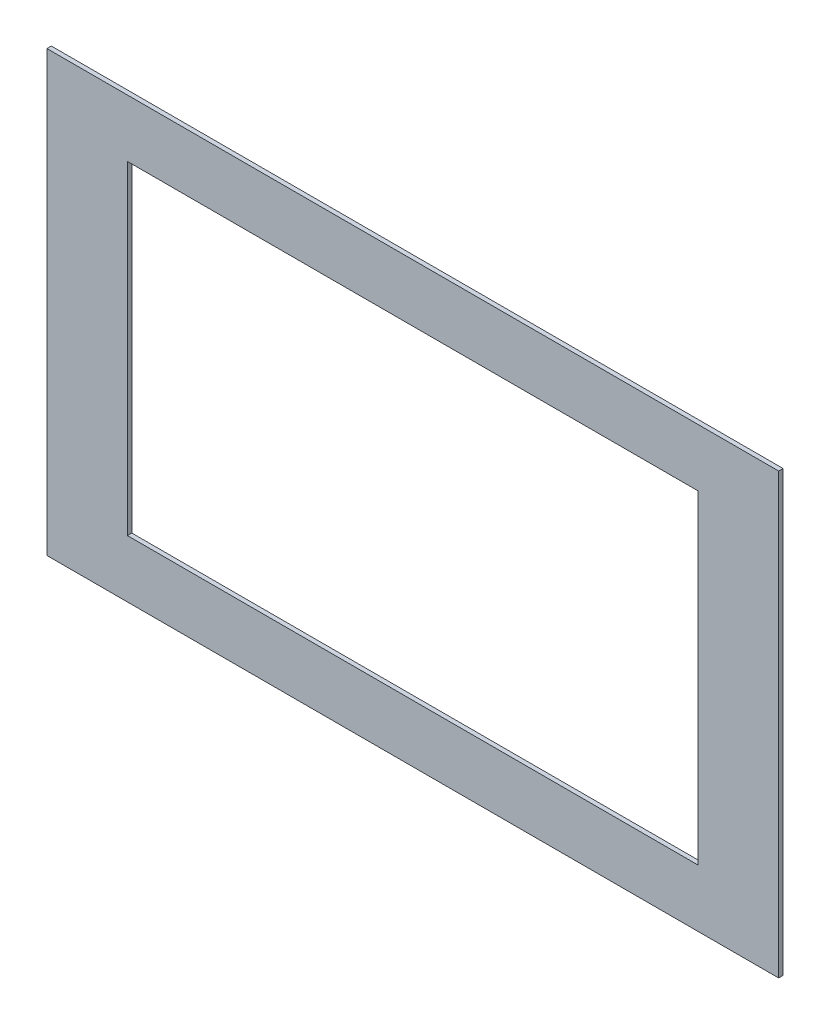
ISO-10303-21;
HEADER;
FILE_DESCRIPTION(('STEP AP214'),'2;1');
FILE_NAME('part.step','',(''),(''),'','','');
FILE_SCHEMA(('AUTOMOTIVE_DESIGN { 1 0 10303 214 1 1 1 1 }'));
ENDSEC;
DATA;
#1=APPLICATION_CONTEXT('core data for automotive mechanical design processes');
#2=APPLICATION_PROTOCOL_DEFINITION('international standard','automotive_design',2000,#1);
#3=PRODUCT_CONTEXT('',#1,'mechanical');
#4=PRODUCT('Part','Part','',(#3));
#5=PRODUCT_RELATED_PRODUCT_CATEGORY('part','',(#4));
#6=PRODUCT_DEFINITION_FORMATION('','',#4);
#7=PRODUCT_DEFINITION_CONTEXT('part definition',#1,'design');
#8=PRODUCT_DEFINITION('design','',#6,#7);
#9=PRODUCT_DEFINITION_SHAPE('','',#8);
#10=(LENGTH_UNIT() NAMED_UNIT(*) SI_UNIT(.MILLI.,.METRE.));
#11=(NAMED_UNIT(*) PLANE_ANGLE_UNIT() SI_UNIT($,.RADIAN.));
#12=(NAMED_UNIT(*) SI_UNIT($,.STERADIAN.) SOLID_ANGLE_UNIT());
#13=UNCERTAINTY_MEASURE_WITH_UNIT(LENGTH_MEASURE(1.E-05),#10,'distance_accuracy_value','');
#14=(GEOMETRIC_REPRESENTATION_CONTEXT(3) GLOBAL_UNCERTAINTY_ASSIGNED_CONTEXT((#13)) GLOBAL_UNIT_ASSIGNED_CONTEXT((#10,
#11,#12)) REPRESENTATION_CONTEXT('',''));
#15=CARTESIAN_POINT('',(0.,0.,0.));
#16=DIRECTION('',(0.,0.,1.));
#17=DIRECTION('',(1.,0.,0.));
#18=AXIS2_PLACEMENT_3D('',#15,#16,#17);
#19=CARTESIAN_POINT('',(-125.,75.,1.5));
#20=DIRECTION('',(1.,0.,0.));
#21=DIRECTION('',(0.,0.,-1.));
#22=AXIS2_PLACEMENT_3D('',#19,#20,#21);
#23=PLANE('',#22);
#24=DIRECTION('',(0.,-1.,0.));
#25=VECTOR('',#24,1.);
#26=CARTESIAN_POINT('',(-125.,75.,0.));
#27=LINE('',#26,#25);
#28=CARTESIAN_POINT('',(-125.,75.,0.));
#29=VERTEX_POINT('',#28);
#30=CARTESIAN_POINT('',(-125.,-75.,0.));
#31=VERTEX_POINT('',#30);
#32=EDGE_CURVE('E136',#29,#31,#27,.T.);
#33=ORIENTED_EDGE('',*,*,#32,.T.);
#34=DIRECTION('',(0.,0.,-1.));
#35=VECTOR('',#34,1.);
#36=CARTESIAN_POINT('',(-125.,-75.,1.5));
#37=LINE('',#36,#35);
#38=CARTESIAN_POINT('',(-125.,-75.,1.5));
#39=VERTEX_POINT('',#38);
#40=EDGE_CURVE('E11',#39,#31,#37,.T.);
#41=ORIENTED_EDGE('',*,*,#40,.F.);
#42=DIRECTION('',(0.,-1.,0.));
#43=VECTOR('',#42,1.);
#44=CARTESIAN_POINT('',(-125.,75.,1.5));
#45=LINE('',#44,#43);
#46=CARTESIAN_POINT('',(-125.,75.,1.5));
#47=VERTEX_POINT('',#46);
#48=EDGE_CURVE('E137',#47,#39,#45,.T.);
#49=ORIENTED_EDGE('',*,*,#48,.F.);
#50=DIRECTION('',(0.,0.,-1.));
#51=VECTOR('',#50,1.);
#52=CARTESIAN_POINT('',(-125.,75.,1.5));
#53=LINE('',#52,#51);
#54=EDGE_CURVE('E147',#47,#29,#53,.T.);
#55=ORIENTED_EDGE('',*,*,#54,.T.);
#56=EDGE_LOOP('',(#33,#41,#49,#55));
#57=FACE_BOUND('',#56,.T.);
#58=ADVANCED_FACE('F35',(#57),#23,.F.);
#59=CARTESIAN_POINT('',(125.,-75.,1.5));
#60=DIRECTION('',(0.,1.,0.));
#61=DIRECTION('',(0.,0.,1.));
#62=AXIS2_PLACEMENT_3D('',#59,#60,#61);
#63=PLANE('',#62);
#64=DIRECTION('',(1.,0.,0.));
#65=VECTOR('',#64,1.);
#66=CARTESIAN_POINT('',(125.,-75.,0.));
#67=LINE('',#66,#65);
#68=CARTESIAN_POINT('',(125.,-75.,0.));
#69=VERTEX_POINT('',#68);
#70=EDGE_CURVE('E150',#31,#69,#67,.T.);
#71=ORIENTED_EDGE('',*,*,#70,.T.);
#72=DIRECTION('',(0.,0.,-1.));
#73=VECTOR('',#72,1.);
#74=CARTESIAN_POINT('',(125.,-75.,1.5));
#75=LINE('',#74,#73);
#76=CARTESIAN_POINT('',(125.,-75.,1.5));
#77=VERTEX_POINT('',#76);
#78=EDGE_CURVE('E42',#77,#69,#75,.T.);
#79=ORIENTED_EDGE('',*,*,#78,.F.);
#80=DIRECTION('',(1.,0.,0.));
#81=VECTOR('',#80,1.);
#82=CARTESIAN_POINT('',(125.,-75.,1.5));
#83=LINE('',#82,#81);
#84=EDGE_CURVE('E140',#39,#77,#83,.T.);
#85=ORIENTED_EDGE('',*,*,#84,.F.);
#86=ORIENTED_EDGE('',*,*,#40,.T.);
#87=EDGE_LOOP('',(#71,#79,#85,#86));
#88=FACE_BOUND('',#87,.T.);
#89=ADVANCED_FACE('F178',(#88),#63,.F.);
#90=CARTESIAN_POINT('',(125.,75.,1.5));
#91=DIRECTION('',(-1.,0.,0.));
#92=DIRECTION('',(0.,0.,1.));
#93=AXIS2_PLACEMENT_3D('',#90,#91,#92);
#94=PLANE('',#93);
#95=DIRECTION('',(0.,1.,0.));
#96=VECTOR('',#95,1.);
#97=CARTESIAN_POINT('',(125.,75.,0.));
#98=LINE('',#97,#96);
#99=CARTESIAN_POINT('',(125.,75.,0.));
#100=VERTEX_POINT('',#99);
#101=EDGE_CURVE('E152',#69,#100,#98,.T.);
#102=ORIENTED_EDGE('',*,*,#101,.T.);
#103=DIRECTION('',(0.,0.,-1.));
#104=VECTOR('',#103,1.);
#105=CARTESIAN_POINT('',(125.,75.,1.5));
#106=LINE('',#105,#104);
#107=CARTESIAN_POINT('',(125.,75.,1.5));
#108=VERTEX_POINT('',#107);
#109=EDGE_CURVE('E157',#108,#100,#106,.T.);
#110=ORIENTED_EDGE('',*,*,#109,.F.);
#111=DIRECTION('',(0.,1.,0.));
#112=VECTOR('',#111,1.);
#113=CARTESIAN_POINT('',(125.,75.,1.5));
#114=LINE('',#113,#112);
#115=EDGE_CURVE('E143',#77,#108,#114,.T.);
#116=ORIENTED_EDGE('',*,*,#115,.F.);
#117=ORIENTED_EDGE('',*,*,#78,.T.);
#118=EDGE_LOOP('',(#102,#110,#116,#117));
#119=FACE_BOUND('',#118,.T.);
#120=ADVANCED_FACE('F164',(#119),#94,.F.);
#121=CARTESIAN_POINT('',(125.,75.,1.5));
#122=DIRECTION('',(0.,-1.,0.));
#123=DIRECTION('',(0.,0.,-1.));
#124=AXIS2_PLACEMENT_3D('',#121,#122,#123);
#125=PLANE('',#124);
#126=DIRECTION('',(-1.,0.,0.));
#127=VECTOR('',#126,1.);
#128=CARTESIAN_POINT('',(125.,75.,0.));
#129=LINE('',#128,#127);
#130=EDGE_CURVE('E141',#100,#29,#129,.T.);
#131=ORIENTED_EDGE('',*,*,#130,.T.);
#132=ORIENTED_EDGE('',*,*,#54,.F.);
#133=DIRECTION('',(-1.,0.,0.));
#134=VECTOR('',#133,1.);
#135=CARTESIAN_POINT('',(125.,75.,1.5));
#136=LINE('',#135,#134);
#137=EDGE_CURVE('E145',#108,#47,#136,.T.);
#138=ORIENTED_EDGE('',*,*,#137,.F.);
#139=ORIENTED_EDGE('',*,*,#109,.T.);
#140=EDGE_LOOP('',(#131,#132,#138,#139));
#141=FACE_BOUND('',#140,.T.);
#142=ADVANCED_FACE('F171',(#141),#125,.F.);
#143=CARTESIAN_POINT('',(0.,0.,1.5));
#144=DIRECTION('',(0.,0.,-1.));
#145=DIRECTION('',(-1.,0.,0.));
#146=AXIS2_PLACEMENT_3D('',#143,#144,#145);
#147=PLANE('',#146);
#148=DIRECTION('',(0.,1.,0.));
#149=VECTOR('',#148,1.);
#150=CARTESIAN_POINT('',(97.5,55.35,1.5));
#151=LINE('',#150,#149);
#152=CARTESIAN_POINT('',(97.5,-55.35,1.5));
#153=VERTEX_POINT('',#152);
#154=CARTESIAN_POINT('',(97.5,55.35,1.5));
#155=VERTEX_POINT('',#154);
#156=EDGE_CURVE('E123',#153,#155,#151,.T.);
#157=ORIENTED_EDGE('',*,*,#156,.F.);
#158=DIRECTION('',(1.,0.,0.));
#159=VECTOR('',#158,1.);
#160=CARTESIAN_POINT('',(97.5,-55.35,1.5));
#161=LINE('',#160,#159);
#162=CARTESIAN_POINT('',(-97.5,-55.35,1.5));
#163=VERTEX_POINT('',#162);
#164=EDGE_CURVE('E116',#163,#153,#161,.T.);
#165=ORIENTED_EDGE('',*,*,#164,.F.);
#166=DIRECTION('',(0.,-1.,0.));
#167=VECTOR('',#166,1.);
#168=CARTESIAN_POINT('',(-97.5,55.35,1.5));
#169=LINE('',#168,#167);
#170=CARTESIAN_POINT('',(-97.5,55.35,1.5));
#171=VERTEX_POINT('',#170);
#172=EDGE_CURVE('E127',#171,#163,#169,.T.);
#173=ORIENTED_EDGE('',*,*,#172,.F.);
#174=DIRECTION('',(-1.,0.,0.));
#175=VECTOR('',#174,1.);
#176=CARTESIAN_POINT('',(97.5,55.35,1.5));
#177=LINE('',#176,#175);
#178=EDGE_CURVE('E49',#155,#171,#177,.T.);
#179=ORIENTED_EDGE('',*,*,#178,.F.);
#180=EDGE_LOOP('',(#157,#165,#173,#179));
#181=FACE_BOUND('',#180,.T.);
#182=ORIENTED_EDGE('',*,*,#48,.T.);
#183=ORIENTED_EDGE('',*,*,#84,.T.);
#184=ORIENTED_EDGE('',*,*,#115,.T.);
#185=ORIENTED_EDGE('',*,*,#137,.T.);
#186=EDGE_LOOP('',(#182,#183,#184,#185));
#187=FACE_BOUND('',#186,.T.);
#188=ADVANCED_FACE('F177',(#181,#187),#147,.F.);
#189=CARTESIAN_POINT('',(0.,0.,0.));
#190=DIRECTION('',(0.,0.,-1.));
#191=DIRECTION('',(-1.,0.,0.));
#192=AXIS2_PLACEMENT_3D('',#189,#190,#191);
#193=PLANE('',#192);
#194=DIRECTION('',(1.,0.,0.));
#195=VECTOR('',#194,1.);
#196=CARTESIAN_POINT('',(97.5,-55.35,0.));
#197=LINE('',#196,#195);
#198=CARTESIAN_POINT('',(-97.5,-55.35,0.));
#199=VERTEX_POINT('',#198);
#200=CARTESIAN_POINT('',(97.5,-55.35,0.));
#201=VERTEX_POINT('',#200);
#202=EDGE_CURVE('E113',#199,#201,#197,.T.);
#203=ORIENTED_EDGE('',*,*,#202,.T.);
#204=DIRECTION('',(0.,1.,0.));
#205=VECTOR('',#204,1.);
#206=CARTESIAN_POINT('',(97.5,55.35,0.));
#207=LINE('',#206,#205);
#208=CARTESIAN_POINT('',(97.5,55.35,0.));
#209=VERTEX_POINT('',#208);
#210=EDGE_CURVE('E100',#201,#209,#207,.T.);
#211=ORIENTED_EDGE('',*,*,#210,.T.);
#212=DIRECTION('',(-1.,0.,0.));
#213=VECTOR('',#212,1.);
#214=CARTESIAN_POINT('',(97.5,55.35,0.));
#215=LINE('',#214,#213);
#216=CARTESIAN_POINT('',(-97.5,55.35,0.));
#217=VERTEX_POINT('',#216);
#218=EDGE_CURVE('E131',#209,#217,#215,.T.);
#219=ORIENTED_EDGE('',*,*,#218,.T.);
#220=DIRECTION('',(0.,-1.,0.));
#221=VECTOR('',#220,1.);
#222=CARTESIAN_POINT('',(-97.5,55.35,0.));
#223=LINE('',#222,#221);
#224=EDGE_CURVE('E121',#217,#199,#223,.T.);
#225=ORIENTED_EDGE('',*,*,#224,.T.);
#226=EDGE_LOOP('',(#203,#211,#219,#225));
#227=FACE_BOUND('',#226,.T.);
#228=ORIENTED_EDGE('',*,*,#32,.F.);
#229=ORIENTED_EDGE('',*,*,#130,.F.);
#230=ORIENTED_EDGE('',*,*,#101,.F.);
#231=ORIENTED_EDGE('',*,*,#70,.F.);
#232=EDGE_LOOP('',(#228,#229,#230,#231));
#233=FACE_BOUND('',#232,.T.);
#234=ADVANCED_FACE('F119',(#227,#233),#193,.T.);
#235=CARTESIAN_POINT('',(97.5,-55.35,-224.230885472987));
#236=DIRECTION('',(0.,-1.,0.));
#237=DIRECTION('',(0.,0.,-1.));
#238=AXIS2_PLACEMENT_3D('',#235,#236,#237);
#239=PLANE('',#238);
#240=DIRECTION('',(0.,0.,1.));
#241=VECTOR('',#240,1.);
#242=CARTESIAN_POINT('',(-97.5,-55.35,-224.230885472987));
#243=LINE('',#242,#241);
#244=EDGE_CURVE('E57',#199,#163,#243,.T.);
#245=ORIENTED_EDGE('',*,*,#244,.T.);
#246=ORIENTED_EDGE('',*,*,#164,.T.);
#247=DIRECTION('',(0.,0.,1.));
#248=VECTOR('',#247,1.);
#249=CARTESIAN_POINT('',(97.5,-55.35,-224.230885472987));
#250=LINE('',#249,#248);
#251=EDGE_CURVE('E104',#201,#153,#250,.T.);
#252=ORIENTED_EDGE('',*,*,#251,.F.);
#253=ORIENTED_EDGE('',*,*,#202,.F.);
#254=EDGE_LOOP('',(#245,#246,#252,#253));
#255=FACE_BOUND('',#254,.T.);
#256=ADVANCED_FACE('F112',(#255),#239,.F.);
#257=CARTESIAN_POINT('',(97.5,55.35,-224.230885472987));
#258=DIRECTION('',(1.,0.,0.));
#259=DIRECTION('',(0.,0.,-1.));
#260=AXIS2_PLACEMENT_3D('',#257,#258,#259);
#261=PLANE('',#260);
#262=ORIENTED_EDGE('',*,*,#251,.T.);
#263=ORIENTED_EDGE('',*,*,#156,.T.);
#264=DIRECTION('',(0.,0.,1.));
#265=VECTOR('',#264,1.);
#266=CARTESIAN_POINT('',(97.5,55.35,-224.230885472987));
#267=LINE('',#266,#265);
#268=EDGE_CURVE('E106',#209,#155,#267,.T.);
#269=ORIENTED_EDGE('',*,*,#268,.F.);
#270=ORIENTED_EDGE('',*,*,#210,.F.);
#271=EDGE_LOOP('',(#262,#263,#269,#270));
#272=FACE_BOUND('',#271,.T.);
#273=ADVANCED_FACE('F102',(#272),#261,.F.);
#274=CARTESIAN_POINT('',(97.5,55.35,-224.230885472987));
#275=DIRECTION('',(0.,1.,0.));
#276=DIRECTION('',(0.,0.,1.));
#277=AXIS2_PLACEMENT_3D('',#274,#275,#276);
#278=PLANE('',#277);
#279=ORIENTED_EDGE('',*,*,#268,.T.);
#280=ORIENTED_EDGE('',*,*,#178,.T.);
#281=DIRECTION('',(0.,0.,1.));
#282=VECTOR('',#281,1.);
#283=CARTESIAN_POINT('',(-97.5,55.35,-224.230885472987));
#284=LINE('',#283,#282);
#285=EDGE_CURVE('E130',#217,#171,#284,.T.);
#286=ORIENTED_EDGE('',*,*,#285,.F.);
#287=ORIENTED_EDGE('',*,*,#218,.F.);
#288=EDGE_LOOP('',(#279,#280,#286,#287));
#289=FACE_BOUND('',#288,.T.);
#290=ADVANCED_FACE('F197',(#289),#278,.F.);
#291=CARTESIAN_POINT('',(-97.5,55.35,-224.230885472987));
#292=DIRECTION('',(-1.,0.,0.));
#293=DIRECTION('',(0.,0.,1.));
#294=AXIS2_PLACEMENT_3D('',#291,#292,#293);
#295=PLANE('',#294);
#296=ORIENTED_EDGE('',*,*,#285,.T.);
#297=ORIENTED_EDGE('',*,*,#172,.T.);
#298=ORIENTED_EDGE('',*,*,#244,.F.);
#299=ORIENTED_EDGE('',*,*,#224,.F.);
#300=EDGE_LOOP('',(#296,#297,#298,#299));
#301=FACE_BOUND('',#300,.T.);
#302=ADVANCED_FACE('F200',(#301),#295,.F.);
#303=CLOSED_SHELL('',(#58,#89,#120,#142,#188,#234,#256,#273,#290,#302));
#304=MANIFOLD_SOLID_BREP('B2',#303);
#305=ADVANCED_BREP_SHAPE_REPRESENTATION('',(#18,#304),#14);
#306=SHAPE_DEFINITION_REPRESENTATION(#9,#305);
ENDSEC;
END-ISO-10303-21;
